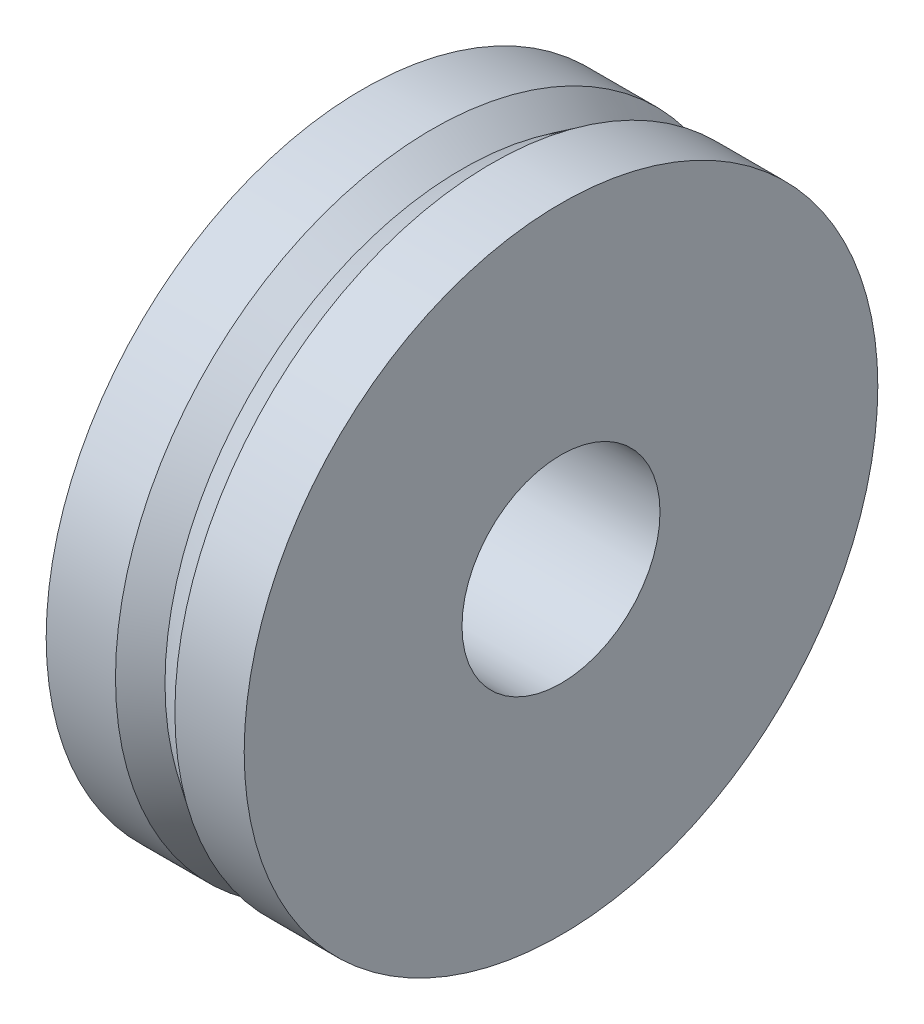
ISO-10303-21;
HEADER;
FILE_DESCRIPTION(('STEP AP214'),'2;1');
FILE_NAME('part.step','',(''),(''),'','','');
FILE_SCHEMA(('AUTOMOTIVE_DESIGN { 1 0 10303 214 1 1 1 1 }'));
ENDSEC;
DATA;
#1=APPLICATION_CONTEXT('core data for automotive mechanical design processes');
#2=APPLICATION_PROTOCOL_DEFINITION('international standard','automotive_design',2000,#1);
#3=PRODUCT_CONTEXT('',#1,'mechanical');
#4=PRODUCT('Part','Part','',(#3));
#5=PRODUCT_RELATED_PRODUCT_CATEGORY('part','',(#4));
#6=PRODUCT_DEFINITION_FORMATION('','',#4);
#7=PRODUCT_DEFINITION_CONTEXT('part definition',#1,'design');
#8=PRODUCT_DEFINITION('design','',#6,#7);
#9=PRODUCT_DEFINITION_SHAPE('','',#8);
#10=(LENGTH_UNIT() NAMED_UNIT(*) SI_UNIT(.MILLI.,.METRE.));
#11=(NAMED_UNIT(*) PLANE_ANGLE_UNIT() SI_UNIT($,.RADIAN.));
#12=(NAMED_UNIT(*) SI_UNIT($,.STERADIAN.) SOLID_ANGLE_UNIT());
#13=UNCERTAINTY_MEASURE_WITH_UNIT(LENGTH_MEASURE(1.E-05),#10,'distance_accuracy_value','');
#14=(GEOMETRIC_REPRESENTATION_CONTEXT(3) GLOBAL_UNCERTAINTY_ASSIGNED_CONTEXT((#13)) GLOBAL_UNIT_ASSIGNED_CONTEXT((#10,
#11,#12)) REPRESENTATION_CONTEXT('',''));
#15=CARTESIAN_POINT('',(0.,0.,0.));
#16=DIRECTION('',(0.,0.,1.));
#17=DIRECTION('',(1.,0.,0.));
#18=AXIS2_PLACEMENT_3D('',#15,#16,#17);
#19=CARTESIAN_POINT('',(5.,0.,0.));
#20=DIRECTION('',(-1.,0.,0.));
#21=DIRECTION('',(0.,0.,1.));
#22=AXIS2_PLACEMENT_3D('',#19,#20,#21);
#23=CYLINDRICAL_SURFACE('',#22,8.);
#24=CARTESIAN_POINT('',(0.,0.,0.));
#25=DIRECTION('',(1.,0.,0.));
#26=DIRECTION('',(0.,0.,-1.));
#27=AXIS2_PLACEMENT_3D('',#24,#25,#26);
#28=CIRCLE('',#27,8.);
#29=CARTESIAN_POINT('',(0.,0.,-8.));
#30=VERTEX_POINT('',#29);
#31=EDGE_CURVE('E36',#30,#30,#28,.T.);
#32=ORIENTED_EDGE('',*,*,#31,.T.);
#33=EDGE_LOOP('',(#32));
#34=FACE_BOUND('',#33,.T.);
#35=CARTESIAN_POINT('',(1.75,0.,0.));
#36=DIRECTION('',(-1.,0.,0.));
#37=DIRECTION('',(0.,0.,1.));
#38=AXIS2_PLACEMENT_3D('',#35,#36,#37);
#39=CIRCLE('',#38,8.);
#40=CARTESIAN_POINT('',(1.75,0.,8.));
#41=VERTEX_POINT('',#40);
#42=EDGE_CURVE('E48',#41,#41,#39,.T.);
#43=ORIENTED_EDGE('',*,*,#42,.T.);
#44=EDGE_LOOP('',(#43));
#45=FACE_BOUND('',#44,.T.);
#46=ADVANCED_FACE('F33',(#34,#45),#23,.T.);
#47=CARTESIAN_POINT('',(5.,0.,0.));
#48=DIRECTION('',(1.,0.,0.));
#49=DIRECTION('',(0.,0.,-1.));
#50=AXIS2_PLACEMENT_3D('',#47,#48,#49);
#51=CIRCLE('',#50,8.);
#52=CARTESIAN_POINT('',(5.,0.,-8.));
#53=VERTEX_POINT('',#52);
#54=EDGE_CURVE('E10',#53,#53,#51,.T.);
#55=ORIENTED_EDGE('',*,*,#54,.F.);
#56=EDGE_LOOP('',(#55));
#57=FACE_BOUND('',#56,.T.);
#58=CARTESIAN_POINT('',(3.25,0.,0.));
#59=DIRECTION('',(-1.,0.,0.));
#60=DIRECTION('',(0.,0.,1.));
#61=AXIS2_PLACEMENT_3D('',#58,#59,#60);
#62=CIRCLE('',#61,8.);
#63=CARTESIAN_POINT('',(3.25,0.,8.));
#64=VERTEX_POINT('',#63);
#65=EDGE_CURVE('E56',#64,#64,#62,.T.);
#66=ORIENTED_EDGE('',*,*,#65,.F.);
#67=EDGE_LOOP('',(#66));
#68=FACE_BOUND('',#67,.T.);
#69=ADVANCED_FACE('F63',(#57,#68),#23,.T.);
#70=CARTESIAN_POINT('',(5.,0.,0.));
#71=DIRECTION('',(1.,0.,0.));
#72=DIRECTION('',(0.,0.,-1.));
#73=AXIS2_PLACEMENT_3D('',#70,#71,#72);
#74=PLANE('',#73);
#75=ORIENTED_EDGE('',*,*,#54,.T.);
#76=EDGE_LOOP('',(#75));
#77=FACE_BOUND('',#76,.T.);
#78=CARTESIAN_POINT('',(5.,0.,0.));
#79=DIRECTION('',(1.,0.,0.));
#80=DIRECTION('',(0.,0.,-1.));
#81=AXIS2_PLACEMENT_3D('',#78,#79,#80);
#82=CIRCLE('',#81,2.5);
#83=CARTESIAN_POINT('',(5.,0.,-2.5));
#84=VERTEX_POINT('',#83);
#85=EDGE_CURVE('E43',#84,#84,#82,.T.);
#86=ORIENTED_EDGE('',*,*,#85,.F.);
#87=EDGE_LOOP('',(#86));
#88=FACE_BOUND('',#87,.T.);
#89=ADVANCED_FACE('F65',(#77,#88),#74,.T.);
#90=CARTESIAN_POINT('',(0.,0.,0.));
#91=DIRECTION('',(1.,0.,0.));
#92=DIRECTION('',(0.,0.,-1.));
#93=AXIS2_PLACEMENT_3D('',#90,#91,#92);
#94=PLANE('',#93);
#95=ORIENTED_EDGE('',*,*,#31,.F.);
#96=EDGE_LOOP('',(#95));
#97=FACE_BOUND('',#96,.T.);
#98=CARTESIAN_POINT('',(0.,0.,0.));
#99=DIRECTION('',(1.,0.,0.));
#100=DIRECTION('',(0.,0.,-1.));
#101=AXIS2_PLACEMENT_3D('',#98,#99,#100);
#102=CIRCLE('',#101,2.5);
#103=CARTESIAN_POINT('',(0.,0.,-2.5));
#104=VERTEX_POINT('',#103);
#105=EDGE_CURVE('E45',#104,#104,#102,.T.);
#106=ORIENTED_EDGE('',*,*,#105,.T.);
#107=EDGE_LOOP('',(#106));
#108=FACE_BOUND('',#107,.T.);
#109=ADVANCED_FACE('F71',(#97,#108),#94,.F.);
#110=CARTESIAN_POINT('',(5.,0.,0.));
#111=DIRECTION('',(-1.,0.,0.));
#112=DIRECTION('',(0.,0.,1.));
#113=AXIS2_PLACEMENT_3D('',#110,#111,#112);
#114=CYLINDRICAL_SURFACE('',#113,2.5);
#115=ORIENTED_EDGE('',*,*,#85,.T.);
#116=EDGE_LOOP('',(#115));
#117=FACE_BOUND('',#116,.T.);
#118=ORIENTED_EDGE('',*,*,#105,.F.);
#119=EDGE_LOOP('',(#118));
#120=FACE_BOUND('',#119,.T.);
#121=ADVANCED_FACE('F82',(#117,#120),#114,.F.);
#122=CARTESIAN_POINT('',(1.75,0.,0.));
#123=DIRECTION('',(-1.,0.,0.));
#124=DIRECTION('',(0.,0.,1.));
#125=AXIS2_PLACEMENT_3D('',#122,#123,#124);
#126=CONICAL_SURFACE('',#125,8.,0.588002603547568);
#127=CARTESIAN_POINT('',(2.5,0.,0.));
#128=DIRECTION('',(-1.,0.,0.));
#129=DIRECTION('',(0.,0.,1.));
#130=AXIS2_PLACEMENT_3D('',#127,#128,#129);
#131=CIRCLE('',#130,7.5);
#132=CARTESIAN_POINT('',(2.5,0.,7.5));
#133=VERTEX_POINT('',#132);
#134=EDGE_CURVE('E53',#133,#133,#131,.T.);
#135=ORIENTED_EDGE('',*,*,#134,.T.);
#136=EDGE_LOOP('',(#135));
#137=FACE_BOUND('',#136,.T.);
#138=ORIENTED_EDGE('',*,*,#42,.F.);
#139=EDGE_LOOP('',(#138));
#140=FACE_BOUND('',#139,.T.);
#141=ADVANCED_FACE('F80',(#137,#140),#126,.T.);
#142=CARTESIAN_POINT('',(2.5,0.,0.));
#143=DIRECTION('',(1.,0.,0.));
#144=DIRECTION('',(0.,0.,-1.));
#145=AXIS2_PLACEMENT_3D('',#142,#143,#144);
#146=CONICAL_SURFACE('',#145,7.5,0.588002603547568);
#147=ORIENTED_EDGE('',*,*,#65,.T.);
#148=EDGE_LOOP('',(#147));
#149=FACE_BOUND('',#148,.T.);
#150=ORIENTED_EDGE('',*,*,#134,.F.);
#151=EDGE_LOOP('',(#150));
#152=FACE_BOUND('',#151,.T.);
#153=ADVANCED_FACE('F60',(#149,#152),#146,.T.);
#154=CLOSED_SHELL('',(#46,#69,#89,#109,#121,#141,#153));
#155=MANIFOLD_SOLID_BREP('B2',#154);
#156=ADVANCED_BREP_SHAPE_REPRESENTATION('',(#18,#155),#14);
#157=SHAPE_DEFINITION_REPRESENTATION(#9,#156);
ENDSEC;
END-ISO-10303-21;
